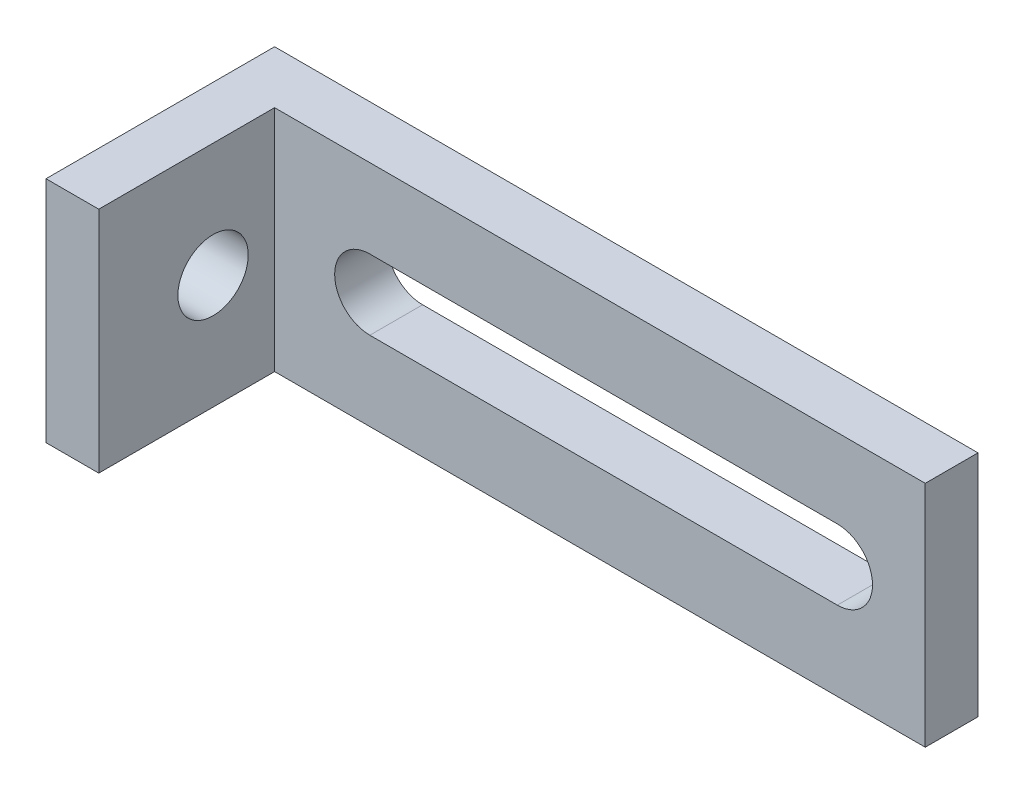
ISO-10303-21;
HEADER;
FILE_DESCRIPTION(('STEP AP214'),'2;1');
FILE_NAME('part.step','',(''),(''),'','','');
FILE_SCHEMA(('AUTOMOTIVE_DESIGN { 1 0 10303 214 1 1 1 1 }'));
ENDSEC;
DATA;
#1=APPLICATION_CONTEXT('core data for automotive mechanical design processes');
#2=APPLICATION_PROTOCOL_DEFINITION('international standard','automotive_design',2000,#1);
#3=PRODUCT_CONTEXT('',#1,'mechanical');
#4=PRODUCT('Part','Part','',(#3));
#5=PRODUCT_RELATED_PRODUCT_CATEGORY('part','',(#4));
#6=PRODUCT_DEFINITION_FORMATION('','',#4);
#7=PRODUCT_DEFINITION_CONTEXT('part definition',#1,'design');
#8=PRODUCT_DEFINITION('design','',#6,#7);
#9=PRODUCT_DEFINITION_SHAPE('','',#8);
#10=(LENGTH_UNIT() NAMED_UNIT(*) SI_UNIT(.MILLI.,.METRE.));
#11=(NAMED_UNIT(*) PLANE_ANGLE_UNIT() SI_UNIT($,.RADIAN.));
#12=(NAMED_UNIT(*) SI_UNIT($,.STERADIAN.) SOLID_ANGLE_UNIT());
#13=UNCERTAINTY_MEASURE_WITH_UNIT(LENGTH_MEASURE(1.E-05),#10,'distance_accuracy_value','');
#14=(GEOMETRIC_REPRESENTATION_CONTEXT(3) GLOBAL_UNCERTAINTY_ASSIGNED_CONTEXT((#13)) GLOBAL_UNIT_ASSIGNED_CONTEXT((#10,
#11,#12)) REPRESENTATION_CONTEXT('',''));
#15=CARTESIAN_POINT('',(0.,0.,0.));
#16=DIRECTION('',(0.,0.,1.));
#17=DIRECTION('',(1.,0.,0.));
#18=AXIS2_PLACEMENT_3D('',#15,#16,#17);
#19=CARTESIAN_POINT('',(20.,6.5,3.));
#20=DIRECTION('',(-1.,0.,0.));
#21=DIRECTION('',(0.,0.,1.));
#22=AXIS2_PLACEMENT_3D('',#19,#20,#21);
#23=PLANE('',#22);
#24=DIRECTION('',(0.,1.,0.));
#25=VECTOR('',#24,1.);
#26=CARTESIAN_POINT('',(20.,6.5,0.));
#27=LINE('',#26,#25);
#28=CARTESIAN_POINT('',(20.,-6.5,0.));
#29=VERTEX_POINT('',#28);
#30=CARTESIAN_POINT('',(20.,6.5,0.));
#31=VERTEX_POINT('',#30);
#32=EDGE_CURVE('E170',#29,#31,#27,.T.);
#33=ORIENTED_EDGE('',*,*,#32,.T.);
#34=DIRECTION('',(0.,0.,-1.));
#35=VECTOR('',#34,1.);
#36=CARTESIAN_POINT('',(20.,6.5,3.));
#37=LINE('',#36,#35);
#38=CARTESIAN_POINT('',(20.,6.5,3.));
#39=VERTEX_POINT('',#38);
#40=EDGE_CURVE('E11',#39,#31,#37,.T.);
#41=ORIENTED_EDGE('',*,*,#40,.F.);
#42=DIRECTION('',(0.,1.,0.));
#43=VECTOR('',#42,1.);
#44=CARTESIAN_POINT('',(20.,6.5,3.));
#45=LINE('',#44,#43);
#46=CARTESIAN_POINT('',(20.,-6.5,3.));
#47=VERTEX_POINT('',#46);
#48=EDGE_CURVE('E171',#47,#39,#45,.T.);
#49=ORIENTED_EDGE('',*,*,#48,.F.);
#50=DIRECTION('',(0.,0.,-1.));
#51=VECTOR('',#50,1.);
#52=CARTESIAN_POINT('',(20.,-6.5,3.));
#53=LINE('',#52,#51);
#54=EDGE_CURVE('E179',#47,#29,#53,.T.);
#55=ORIENTED_EDGE('',*,*,#54,.T.);
#56=EDGE_LOOP('',(#33,#41,#49,#55));
#57=FACE_BOUND('',#56,.T.);
#58=ADVANCED_FACE('F36',(#57),#23,.F.);
#59=CARTESIAN_POINT('',(-20.,6.5,3.));
#60=DIRECTION('',(0.,-1.,0.));
#61=DIRECTION('',(0.,0.,-1.));
#62=AXIS2_PLACEMENT_3D('',#59,#60,#61);
#63=PLANE('',#62);
#64=DIRECTION('',(-1.,0.,0.));
#65=VECTOR('',#64,1.);
#66=CARTESIAN_POINT('',(-20.,6.5,0.));
#67=LINE('',#66,#65);
#68=CARTESIAN_POINT('',(-20.,6.5,0.));
#69=VERTEX_POINT('',#68);
#70=EDGE_CURVE('E182',#31,#69,#67,.T.);
#71=ORIENTED_EDGE('',*,*,#70,.T.);
#72=DIRECTION('',(0.,0.,-1.));
#73=VECTOR('',#72,1.);
#74=CARTESIAN_POINT('',(-20.,6.5,3.));
#75=LINE('',#74,#73);
#76=CARTESIAN_POINT('',(-20.,6.5,13.));
#77=VERTEX_POINT('',#76);
#78=EDGE_CURVE('E44',#77,#69,#75,.T.);
#79=ORIENTED_EDGE('',*,*,#78,.F.);
#80=DIRECTION('',(-1.,0.,0.));
#81=VECTOR('',#80,1.);
#82=CARTESIAN_POINT('',(-20.,6.5,13.));
#83=LINE('',#82,#81);
#84=CARTESIAN_POINT('',(-17.,6.5,13.));
#85=VERTEX_POINT('',#84);
#86=EDGE_CURVE('E159',#85,#77,#83,.T.);
#87=ORIENTED_EDGE('',*,*,#86,.F.);
#88=DIRECTION('',(0.,0.,-1.));
#89=VECTOR('',#88,1.);
#90=CARTESIAN_POINT('',(-17.,6.5,13.));
#91=LINE('',#90,#89);
#92=CARTESIAN_POINT('',(-17.,6.5,3.));
#93=VERTEX_POINT('',#92);
#94=EDGE_CURVE('E162',#85,#93,#91,.T.);
#95=ORIENTED_EDGE('',*,*,#94,.T.);
#96=DIRECTION('',(-1.,0.,0.));
#97=VECTOR('',#96,1.);
#98=CARTESIAN_POINT('',(-20.,6.5,3.));
#99=LINE('',#98,#97);
#100=EDGE_CURVE('E174',#39,#93,#99,.T.);
#101=ORIENTED_EDGE('',*,*,#100,.F.);
#102=ORIENTED_EDGE('',*,*,#40,.T.);
#103=EDGE_LOOP('',(#71,#79,#87,#95,#101,#102));
#104=FACE_BOUND('',#103,.T.);
#105=ADVANCED_FACE('F218',(#104),#63,.F.);
#106=CARTESIAN_POINT('',(-20.,6.5,3.));
#107=DIRECTION('',(1.,0.,0.));
#108=DIRECTION('',(0.,0.,-1.));
#109=AXIS2_PLACEMENT_3D('',#106,#107,#108);
#110=PLANE('',#109);
#111=CARTESIAN_POINT('',(-20.,0.,6.5));
#112=DIRECTION('',(-1.,0.,0.));
#113=DIRECTION('',(0.,0.,1.));
#114=AXIS2_PLACEMENT_3D('',#111,#112,#113);
#115=CIRCLE('',#114,2.);
#116=CARTESIAN_POINT('',(-20.,0.,8.5));
#117=VERTEX_POINT('',#116);
#118=EDGE_CURVE('E148',#117,#117,#115,.T.);
#119=ORIENTED_EDGE('',*,*,#118,.F.);
#120=EDGE_LOOP('',(#119));
#121=FACE_BOUND('',#120,.T.);
#122=DIRECTION('',(0.,-1.,0.));
#123=VECTOR('',#122,1.);
#124=CARTESIAN_POINT('',(-20.,6.5,0.));
#125=LINE('',#124,#123);
#126=CARTESIAN_POINT('',(-20.,-6.5,0.));
#127=VERTEX_POINT('',#126);
#128=EDGE_CURVE('E184',#69,#127,#125,.T.);
#129=ORIENTED_EDGE('',*,*,#128,.T.);
#130=DIRECTION('',(0.,0.,-1.));
#131=VECTOR('',#130,1.);
#132=CARTESIAN_POINT('',(-20.,-6.5,3.));
#133=LINE('',#132,#131);
#134=CARTESIAN_POINT('',(-20.,-6.5,13.));
#135=VERTEX_POINT('',#134);
#136=EDGE_CURVE('E189',#135,#127,#133,.T.);
#137=ORIENTED_EDGE('',*,*,#136,.F.);
#138=DIRECTION('',(0.,-1.,0.));
#139=VECTOR('',#138,1.);
#140=CARTESIAN_POINT('',(-20.,6.5,13.));
#141=LINE('',#140,#139);
#142=EDGE_CURVE('E151',#77,#135,#141,.T.);
#143=ORIENTED_EDGE('',*,*,#142,.F.);
#144=ORIENTED_EDGE('',*,*,#78,.T.);
#145=EDGE_LOOP('',(#129,#137,#143,#144));
#146=FACE_BOUND('',#145,.T.);
#147=ADVANCED_FACE('F196',(#121,#146),#110,.F.);
#148=CARTESIAN_POINT('',(-20.,-6.5,3.));
#149=DIRECTION('',(0.,1.,0.));
#150=DIRECTION('',(0.,0.,1.));
#151=AXIS2_PLACEMENT_3D('',#148,#149,#150);
#152=PLANE('',#151);
#153=DIRECTION('',(1.,0.,0.));
#154=VECTOR('',#153,1.);
#155=CARTESIAN_POINT('',(-20.,-6.5,0.));
#156=LINE('',#155,#154);
#157=EDGE_CURVE('E175',#127,#29,#156,.T.);
#158=ORIENTED_EDGE('',*,*,#157,.T.);
#159=ORIENTED_EDGE('',*,*,#54,.F.);
#160=DIRECTION('',(1.,0.,0.));
#161=VECTOR('',#160,1.);
#162=CARTESIAN_POINT('',(-20.,-6.5,3.));
#163=LINE('',#162,#161);
#164=CARTESIAN_POINT('',(-17.,-6.5,3.));
#165=VERTEX_POINT('',#164);
#166=EDGE_CURVE('E177',#165,#47,#163,.T.);
#167=ORIENTED_EDGE('',*,*,#166,.F.);
#168=DIRECTION('',(0.,0.,-1.));
#169=VECTOR('',#168,1.);
#170=CARTESIAN_POINT('',(-17.,-6.5,13.));
#171=LINE('',#170,#169);
#172=CARTESIAN_POINT('',(-17.,-6.5,13.));
#173=VERTEX_POINT('',#172);
#174=EDGE_CURVE('E167',#173,#165,#171,.T.);
#175=ORIENTED_EDGE('',*,*,#174,.F.);
#176=DIRECTION('',(1.,0.,0.));
#177=VECTOR('',#176,1.);
#178=CARTESIAN_POINT('',(-20.,-6.5,13.));
#179=LINE('',#178,#177);
#180=EDGE_CURVE('E154',#135,#173,#179,.T.);
#181=ORIENTED_EDGE('',*,*,#180,.F.);
#182=ORIENTED_EDGE('',*,*,#136,.T.);
#183=EDGE_LOOP('',(#158,#159,#167,#175,#181,#182));
#184=FACE_BOUND('',#183,.T.);
#185=ADVANCED_FACE('F203',(#184),#152,.F.);
#186=CARTESIAN_POINT('',(0.,0.,3.));
#187=DIRECTION('',(0.,0.,1.));
#188=DIRECTION('',(1.,0.,0.));
#189=AXIS2_PLACEMENT_3D('',#186,#187,#188);
#190=PLANE('',#189);
#191=CARTESIAN_POINT('',(15.,0.,3.));
#192=DIRECTION('',(0.,0.,1.));
#193=DIRECTION('',(1.,0.,0.));
#194=AXIS2_PLACEMENT_3D('',#191,#192,#193);
#195=CIRCLE('',#194,2.);
#196=CARTESIAN_POINT('',(15.,-2.,3.));
#197=VERTEX_POINT('',#196);
#198=CARTESIAN_POINT('',(15.,2.,3.));
#199=VERTEX_POINT('',#198);
#200=EDGE_CURVE('E146',#197,#199,#195,.T.);
#201=ORIENTED_EDGE('',*,*,#200,.F.);
#202=DIRECTION('',(1.,0.,0.));
#203=VECTOR('',#202,1.);
#204=CARTESIAN_POINT('',(0.,-2.,3.));
#205=LINE('',#204,#203);
#206=CARTESIAN_POINT('',(-11.5846111717946,-2.,3.));
#207=VERTEX_POINT('',#206);
#208=EDGE_CURVE('E139',#207,#197,#205,.T.);
#209=ORIENTED_EDGE('',*,*,#208,.F.);
#210=CARTESIAN_POINT('',(-11.5846111717946,0.,3.));
#211=DIRECTION('',(0.,0.,1.));
#212=DIRECTION('',(1.,0.,0.));
#213=AXIS2_PLACEMENT_3D('',#210,#211,#212);
#214=CIRCLE('',#213,2.);
#215=CARTESIAN_POINT('',(-11.5846111717946,2.,3.));
#216=VERTEX_POINT('',#215);
#217=EDGE_CURVE('E119',#216,#207,#214,.T.);
#218=ORIENTED_EDGE('',*,*,#217,.F.);
#219=DIRECTION('',(-1.,0.,0.));
#220=VECTOR('',#219,1.);
#221=CARTESIAN_POINT('',(0.,2.,3.));
#222=LINE('',#221,#220);
#223=EDGE_CURVE('E144',#199,#216,#222,.T.);
#224=ORIENTED_EDGE('',*,*,#223,.F.);
#225=EDGE_LOOP('',(#201,#209,#218,#224));
#226=FACE_BOUND('',#225,.T.);
#227=DIRECTION('',(0.,1.,0.));
#228=VECTOR('',#227,1.);
#229=CARTESIAN_POINT('',(-17.,6.5,3.));
#230=LINE('',#229,#228);
#231=EDGE_CURVE('E155',#165,#93,#230,.T.);
#232=ORIENTED_EDGE('',*,*,#231,.F.);
#233=ORIENTED_EDGE('',*,*,#166,.T.);
#234=ORIENTED_EDGE('',*,*,#48,.T.);
#235=ORIENTED_EDGE('',*,*,#100,.T.);
#236=EDGE_LOOP('',(#232,#233,#234,#235));
#237=FACE_BOUND('',#236,.T.);
#238=ADVANCED_FACE('F210',(#226,#237),#190,.T.);
#239=CARTESIAN_POINT('',(0.,0.,0.));
#240=DIRECTION('',(0.,0.,1.));
#241=DIRECTION('',(1.,0.,0.));
#242=AXIS2_PLACEMENT_3D('',#239,#240,#241);
#243=PLANE('',#242);
#244=DIRECTION('',(-1.,0.,0.));
#245=VECTOR('',#244,1.);
#246=CARTESIAN_POINT('',(15.,-2.,0.));
#247=LINE('',#246,#245);
#248=CARTESIAN_POINT('',(15.,-2.,0.));
#249=VERTEX_POINT('',#248);
#250=CARTESIAN_POINT('',(-11.5846111717946,-2.,0.));
#251=VERTEX_POINT('',#250);
#252=EDGE_CURVE('E125',#249,#251,#247,.T.);
#253=ORIENTED_EDGE('',*,*,#252,.F.);
#254=CARTESIAN_POINT('',(15.,0.,0.));
#255=DIRECTION('',(0.,0.,-1.));
#256=DIRECTION('',(-1.,0.,0.));
#257=AXIS2_PLACEMENT_3D('',#254,#255,#256);
#258=CIRCLE('',#257,2.);
#259=CARTESIAN_POINT('',(15.,2.,0.));
#260=VERTEX_POINT('',#259);
#261=EDGE_CURVE('E59',#260,#249,#258,.T.);
#262=ORIENTED_EDGE('',*,*,#261,.F.);
#263=DIRECTION('',(1.,0.,0.));
#264=VECTOR('',#263,1.);
#265=CARTESIAN_POINT('',(15.,2.,0.));
#266=LINE('',#265,#264);
#267=CARTESIAN_POINT('',(-11.5846111717946,2.,0.));
#268=VERTEX_POINT('',#267);
#269=EDGE_CURVE('E132',#268,#260,#266,.T.);
#270=ORIENTED_EDGE('',*,*,#269,.F.);
#271=CARTESIAN_POINT('',(-11.5846111717946,0.,0.));
#272=DIRECTION('',(0.,0.,-1.));
#273=DIRECTION('',(-1.,0.,0.));
#274=AXIS2_PLACEMENT_3D('',#271,#272,#273);
#275=CIRCLE('',#274,2.);
#276=EDGE_CURVE('E116',#251,#268,#275,.T.);
#277=ORIENTED_EDGE('',*,*,#276,.F.);
#278=EDGE_LOOP('',(#253,#262,#270,#277));
#279=FACE_BOUND('',#278,.T.);
#280=ORIENTED_EDGE('',*,*,#32,.F.);
#281=ORIENTED_EDGE('',*,*,#157,.F.);
#282=ORIENTED_EDGE('',*,*,#128,.F.);
#283=ORIENTED_EDGE('',*,*,#70,.F.);
#284=EDGE_LOOP('',(#280,#281,#282,#283));
#285=FACE_BOUND('',#284,.T.);
#286=ADVANCED_FACE('F129',(#279,#285),#243,.F.);
#287=CARTESIAN_POINT('',(-17.,6.5,13.));
#288=DIRECTION('',(-1.,0.,0.));
#289=DIRECTION('',(0.,0.,1.));
#290=AXIS2_PLACEMENT_3D('',#287,#288,#289);
#291=PLANE('',#290);
#292=CARTESIAN_POINT('',(-17.,0.,6.5));
#293=DIRECTION('',(-1.,0.,0.));
#294=DIRECTION('',(0.,0.,1.));
#295=AXIS2_PLACEMENT_3D('',#292,#293,#294);
#296=CIRCLE('',#295,2.);
#297=CARTESIAN_POINT('',(-17.,0.,8.5));
#298=VERTEX_POINT('',#297);
#299=EDGE_CURVE('E39',#298,#298,#296,.T.);
#300=ORIENTED_EDGE('',*,*,#299,.T.);
#301=EDGE_LOOP('',(#300));
#302=FACE_BOUND('',#301,.T.);
#303=ORIENTED_EDGE('',*,*,#231,.T.);
#304=ORIENTED_EDGE('',*,*,#94,.F.);
#305=DIRECTION('',(0.,1.,0.));
#306=VECTOR('',#305,1.);
#307=CARTESIAN_POINT('',(-17.,6.5,13.));
#308=LINE('',#307,#306);
#309=EDGE_CURVE('E157',#173,#85,#308,.T.);
#310=ORIENTED_EDGE('',*,*,#309,.F.);
#311=ORIENTED_EDGE('',*,*,#174,.T.);
#312=EDGE_LOOP('',(#303,#304,#310,#311));
#313=FACE_BOUND('',#312,.T.);
#314=ADVANCED_FACE('F214',(#302,#313),#291,.F.);
#315=CARTESIAN_POINT('',(0.,0.,13.));
#316=DIRECTION('',(0.,0.,1.));
#317=DIRECTION('',(1.,0.,0.));
#318=AXIS2_PLACEMENT_3D('',#315,#316,#317);
#319=PLANE('',#318);
#320=ORIENTED_EDGE('',*,*,#142,.T.);
#321=ORIENTED_EDGE('',*,*,#180,.T.);
#322=ORIENTED_EDGE('',*,*,#309,.T.);
#323=ORIENTED_EDGE('',*,*,#86,.T.);
#324=EDGE_LOOP('',(#320,#321,#322,#323));
#325=FACE_BOUND('',#324,.T.);
#326=ADVANCED_FACE('F217',(#325),#319,.T.);
#327=CARTESIAN_POINT('',(-8.00000000000001,0.,6.5));
#328=DIRECTION('',(-1.,0.,0.));
#329=DIRECTION('',(0.,0.,1.));
#330=AXIS2_PLACEMENT_3D('',#327,#328,#329);
#331=CYLINDRICAL_SURFACE('',#330,2.);
#332=ORIENTED_EDGE('',*,*,#118,.T.);
#333=EDGE_LOOP('',(#332));
#334=FACE_BOUND('',#333,.T.);
#335=ORIENTED_EDGE('',*,*,#299,.F.);
#336=EDGE_LOOP('',(#335));
#337=FACE_BOUND('',#336,.T.);
#338=ADVANCED_FACE('F239',(#334,#337),#331,.F.);
#339=CARTESIAN_POINT('',(15.,0.,12.));
#340=DIRECTION('',(0.,0.,-1.));
#341=DIRECTION('',(-1.,0.,0.));
#342=AXIS2_PLACEMENT_3D('',#339,#340,#341);
#343=CYLINDRICAL_SURFACE('',#342,2.);
#344=ORIENTED_EDGE('',*,*,#200,.T.);
#345=DIRECTION('',(0.,0.,-1.));
#346=VECTOR('',#345,1.);
#347=CARTESIAN_POINT('',(15.,2.,12.));
#348=LINE('',#347,#346);
#349=EDGE_CURVE('E137',#199,#260,#348,.T.);
#350=ORIENTED_EDGE('',*,*,#349,.T.);
#351=ORIENTED_EDGE('',*,*,#261,.T.);
#352=DIRECTION('',(0.,0.,-1.));
#353=VECTOR('',#352,1.);
#354=CARTESIAN_POINT('',(15.,-2.,12.));
#355=LINE('',#354,#353);
#356=EDGE_CURVE('E122',#197,#249,#355,.T.);
#357=ORIENTED_EDGE('',*,*,#356,.F.);
#358=EDGE_LOOP('',(#344,#350,#351,#357));
#359=FACE_BOUND('',#358,.T.);
#360=ADVANCED_FACE('F242',(#359),#343,.F.);
#361=CARTESIAN_POINT('',(15.,2.,12.));
#362=DIRECTION('',(0.,1.,0.));
#363=DIRECTION('',(0.,0.,1.));
#364=AXIS2_PLACEMENT_3D('',#361,#362,#363);
#365=PLANE('',#364);
#366=ORIENTED_EDGE('',*,*,#223,.T.);
#367=DIRECTION('',(0.,0.,-1.));
#368=VECTOR('',#367,1.);
#369=CARTESIAN_POINT('',(-11.5846111717946,2.,12.));
#370=LINE('',#369,#368);
#371=EDGE_CURVE('E121',#216,#268,#370,.T.);
#372=ORIENTED_EDGE('',*,*,#371,.T.);
#373=ORIENTED_EDGE('',*,*,#269,.T.);
#374=ORIENTED_EDGE('',*,*,#349,.F.);
#375=EDGE_LOOP('',(#366,#372,#373,#374));
#376=FACE_BOUND('',#375,.T.);
#377=ADVANCED_FACE('F246',(#376),#365,.F.);
#378=CARTESIAN_POINT('',(-11.5846111717946,0.,12.));
#379=DIRECTION('',(0.,0.,-1.));
#380=DIRECTION('',(-1.,0.,0.));
#381=AXIS2_PLACEMENT_3D('',#378,#379,#380);
#382=CYLINDRICAL_SURFACE('',#381,2.);
#383=ORIENTED_EDGE('',*,*,#217,.T.);
#384=DIRECTION('',(0.,0.,-1.));
#385=VECTOR('',#384,1.);
#386=CARTESIAN_POINT('',(-11.5846111717946,-2.,12.));
#387=LINE('',#386,#385);
#388=EDGE_CURVE('E51',#207,#251,#387,.T.);
#389=ORIENTED_EDGE('',*,*,#388,.T.);
#390=ORIENTED_EDGE('',*,*,#276,.T.);
#391=ORIENTED_EDGE('',*,*,#371,.F.);
#392=EDGE_LOOP('',(#383,#389,#390,#391));
#393=FACE_BOUND('',#392,.T.);
#394=ADVANCED_FACE('F113',(#393),#382,.F.);
#395=CARTESIAN_POINT('',(15.,-2.,12.));
#396=DIRECTION('',(0.,-1.,0.));
#397=DIRECTION('',(0.,0.,-1.));
#398=AXIS2_PLACEMENT_3D('',#395,#396,#397);
#399=PLANE('',#398);
#400=ORIENTED_EDGE('',*,*,#208,.T.);
#401=ORIENTED_EDGE('',*,*,#356,.T.);
#402=ORIENTED_EDGE('',*,*,#252,.T.);
#403=ORIENTED_EDGE('',*,*,#388,.F.);
#404=EDGE_LOOP('',(#400,#401,#402,#403));
#405=FACE_BOUND('',#404,.T.);
#406=ADVANCED_FACE('F126',(#405),#399,.F.);
#407=CLOSED_SHELL('',(#58,#105,#147,#185,#238,#286,#314,#326,#338,#360,#377,#394,#406));
#408=MANIFOLD_SOLID_BREP('B2',#407);
#409=ADVANCED_BREP_SHAPE_REPRESENTATION('',(#18,#408),#14);
#410=SHAPE_DEFINITION_REPRESENTATION(#9,#409);
ENDSEC;
END-ISO-10303-21;
